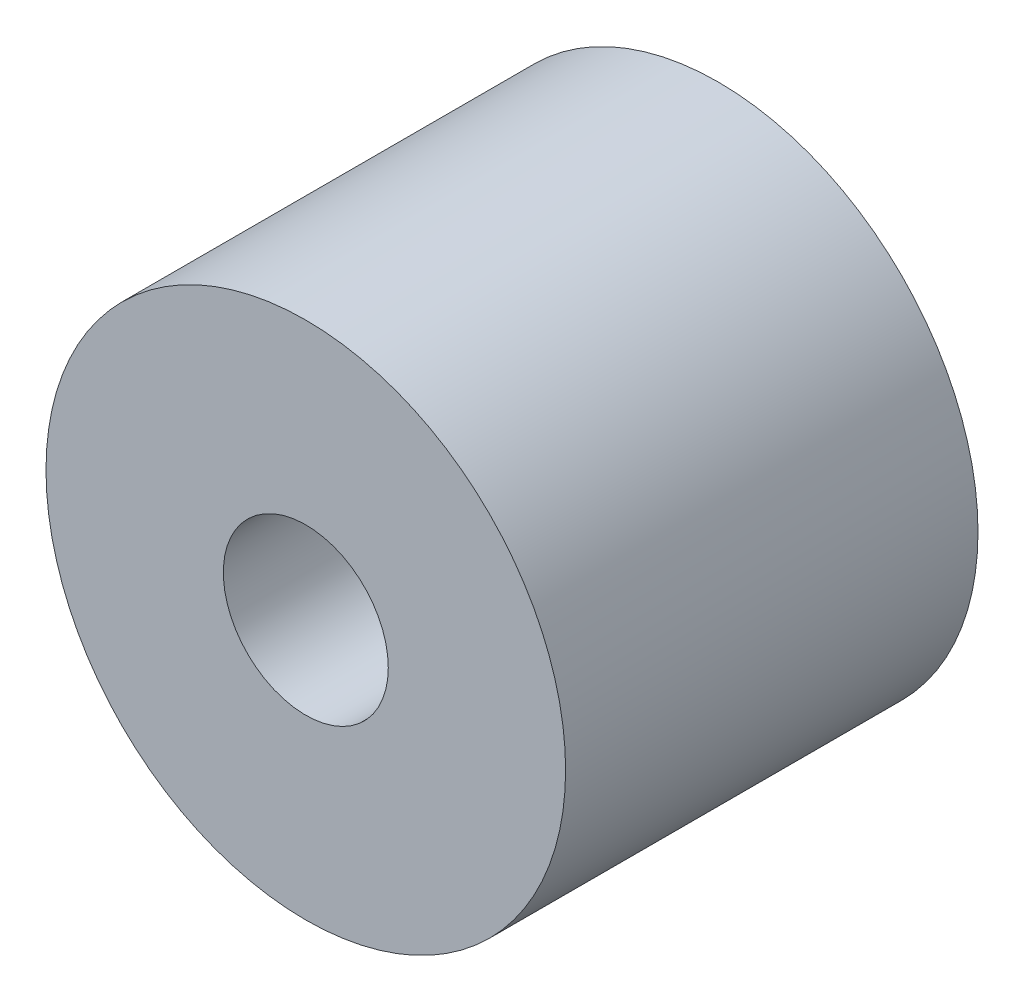
ISO-10303-21;
HEADER;
FILE_DESCRIPTION(('STEP AP214'),'2;1');
FILE_NAME('part.step','',(''),(''),'','','');
FILE_SCHEMA(('AUTOMOTIVE_DESIGN { 1 0 10303 214 1 1 1 1 }'));
ENDSEC;
DATA;
#1=APPLICATION_CONTEXT('core data for automotive mechanical design processes');
#2=APPLICATION_PROTOCOL_DEFINITION('international standard','automotive_design',2000,#1);
#3=PRODUCT_CONTEXT('',#1,'mechanical');
#4=PRODUCT('Part','Part','',(#3));
#5=PRODUCT_RELATED_PRODUCT_CATEGORY('part','',(#4));
#6=PRODUCT_DEFINITION_FORMATION('','',#4);
#7=PRODUCT_DEFINITION_CONTEXT('part definition',#1,'design');
#8=PRODUCT_DEFINITION('design','',#6,#7);
#9=PRODUCT_DEFINITION_SHAPE('','',#8);
#10=(LENGTH_UNIT() NAMED_UNIT(*) SI_UNIT(.MILLI.,.METRE.));
#11=(NAMED_UNIT(*) PLANE_ANGLE_UNIT() SI_UNIT($,.RADIAN.));
#12=(NAMED_UNIT(*) SI_UNIT($,.STERADIAN.) SOLID_ANGLE_UNIT());
#13=UNCERTAINTY_MEASURE_WITH_UNIT(LENGTH_MEASURE(1.E-05),#10,'distance_accuracy_value','');
#14=(GEOMETRIC_REPRESENTATION_CONTEXT(3) GLOBAL_UNCERTAINTY_ASSIGNED_CONTEXT((#13)) GLOBAL_UNIT_ASSIGNED_CONTEXT((#10,
#11,#12)) REPRESENTATION_CONTEXT('',''));
#15=CARTESIAN_POINT('',(0.,0.,0.));
#16=DIRECTION('',(0.,0.,1.));
#17=DIRECTION('',(1.,0.,0.));
#18=AXIS2_PLACEMENT_3D('',#15,#16,#17);
#19=CARTESIAN_POINT('',(0.,0.,25.));
#20=DIRECTION('',(0.,0.,1.));
#21=DIRECTION('',(1.,0.,0.));
#22=AXIS2_PLACEMENT_3D('',#19,#20,#21);
#23=PLANE('',#22);
#24=CARTESIAN_POINT('',(0.,0.,25.));
#25=DIRECTION('',(0.,0.,1.));
#26=DIRECTION('',(1.,0.,0.));
#27=AXIS2_PLACEMENT_3D('',#24,#25,#26);
#28=CIRCLE('',#27,15.75);
#29=CARTESIAN_POINT('',(15.75,0.,25.));
#30=VERTEX_POINT('',#29);
#31=EDGE_CURVE('E10',#30,#30,#28,.T.);
#32=ORIENTED_EDGE('',*,*,#31,.T.);
#33=EDGE_LOOP('',(#32));
#34=FACE_BOUND('',#33,.T.);
#35=CARTESIAN_POINT('',(0.,0.,25.));
#36=DIRECTION('',(0.,0.,1.));
#37=DIRECTION('',(1.,0.,0.));
#38=AXIS2_PLACEMENT_3D('',#35,#36,#37);
#39=CIRCLE('',#38,5.);
#40=CARTESIAN_POINT('',(5.,0.,25.));
#41=VERTEX_POINT('',#40);
#42=EDGE_CURVE('E42',#41,#41,#39,.T.);
#43=ORIENTED_EDGE('',*,*,#42,.F.);
#44=EDGE_LOOP('',(#43));
#45=FACE_BOUND('',#44,.T.);
#46=ADVANCED_FACE('F31',(#34,#45),#23,.T.);
#47=CARTESIAN_POINT('',(0.,0.,0.));
#48=DIRECTION('',(0.,0.,1.));
#49=DIRECTION('',(1.,0.,0.));
#50=AXIS2_PLACEMENT_3D('',#47,#48,#49);
#51=PLANE('',#50);
#52=CARTESIAN_POINT('',(0.,0.,0.));
#53=DIRECTION('',(0.,0.,1.));
#54=DIRECTION('',(1.,0.,0.));
#55=AXIS2_PLACEMENT_3D('',#52,#53,#54);
#56=CIRCLE('',#55,15.75);
#57=CARTESIAN_POINT('',(15.75,0.,0.));
#58=VERTEX_POINT('',#57);
#59=EDGE_CURVE('E35',#58,#58,#56,.T.);
#60=ORIENTED_EDGE('',*,*,#59,.F.);
#61=EDGE_LOOP('',(#60));
#62=FACE_BOUND('',#61,.T.);
#63=CARTESIAN_POINT('',(0.,0.,0.));
#64=DIRECTION('',(0.,0.,1.));
#65=DIRECTION('',(1.,0.,0.));
#66=AXIS2_PLACEMENT_3D('',#63,#64,#65);
#67=CIRCLE('',#66,5.);
#68=CARTESIAN_POINT('',(5.,0.,0.));
#69=VERTEX_POINT('',#68);
#70=EDGE_CURVE('E44',#69,#69,#67,.T.);
#71=ORIENTED_EDGE('',*,*,#70,.T.);
#72=EDGE_LOOP('',(#71));
#73=FACE_BOUND('',#72,.T.);
#74=ADVANCED_FACE('F54',(#62,#73),#51,.F.);
#75=CARTESIAN_POINT('',(0.,0.,25.));
#76=DIRECTION('',(0.,0.,-1.));
#77=DIRECTION('',(-1.,0.,0.));
#78=AXIS2_PLACEMENT_3D('',#75,#76,#77);
#79=CYLINDRICAL_SURFACE('',#78,15.75);
#80=ORIENTED_EDGE('',*,*,#31,.F.);
#81=EDGE_LOOP('',(#80));
#82=FACE_BOUND('',#81,.T.);
#83=ORIENTED_EDGE('',*,*,#59,.T.);
#84=EDGE_LOOP('',(#83));
#85=FACE_BOUND('',#84,.T.);
#86=ADVANCED_FACE('F33',(#82,#85),#79,.T.);
#87=CARTESIAN_POINT('',(0.,0.,25.));
#88=DIRECTION('',(0.,0.,-1.));
#89=DIRECTION('',(-1.,0.,0.));
#90=AXIS2_PLACEMENT_3D('',#87,#88,#89);
#91=CYLINDRICAL_SURFACE('',#90,5.);
#92=ORIENTED_EDGE('',*,*,#42,.T.);
#93=EDGE_LOOP('',(#92));
#94=FACE_BOUND('',#93,.T.);
#95=ORIENTED_EDGE('',*,*,#70,.F.);
#96=EDGE_LOOP('',(#95));
#97=FACE_BOUND('',#96,.T.);
#98=ADVANCED_FACE('F50',(#94,#97),#91,.F.);
#99=CLOSED_SHELL('',(#46,#74,#86,#98));
#100=MANIFOLD_SOLID_BREP('B2',#99);
#101=ADVANCED_BREP_SHAPE_REPRESENTATION('',(#18,#100),#14);
#102=SHAPE_DEFINITION_REPRESENTATION(#9,#101);
ENDSEC;
END-ISO-10303-21;
